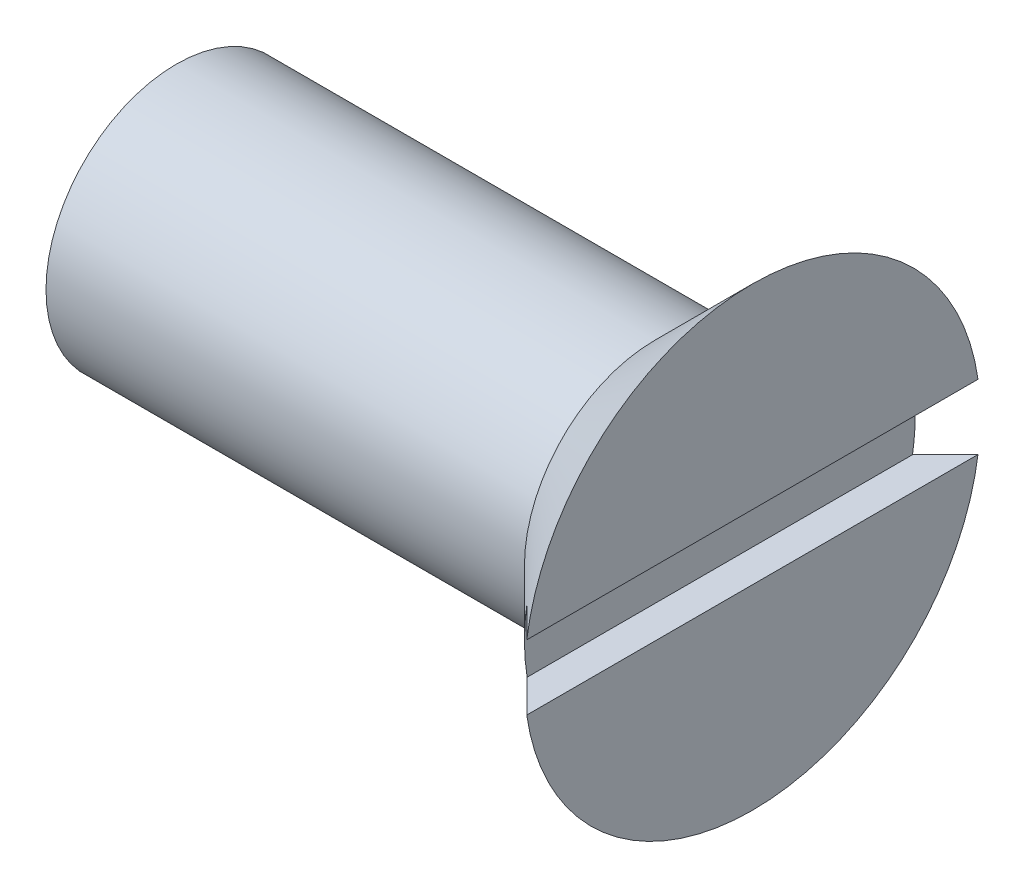
ISO-10303-21;
HEADER;
FILE_DESCRIPTION(('STEP AP214'),'2;1');
FILE_NAME('part.step','',(''),(''),'','','');
FILE_SCHEMA(('AUTOMOTIVE_DESIGN { 1 0 10303 214 1 1 1 1 }'));
ENDSEC;
DATA;
#1=APPLICATION_CONTEXT('core data for automotive mechanical design processes');
#2=APPLICATION_PROTOCOL_DEFINITION('international standard','automotive_design',2000,#1);
#3=PRODUCT_CONTEXT('',#1,'mechanical');
#4=PRODUCT('Part','Part','',(#3));
#5=PRODUCT_RELATED_PRODUCT_CATEGORY('part','',(#4));
#6=PRODUCT_DEFINITION_FORMATION('','',#4);
#7=PRODUCT_DEFINITION_CONTEXT('part definition',#1,'design');
#8=PRODUCT_DEFINITION('design','',#6,#7);
#9=PRODUCT_DEFINITION_SHAPE('','',#8);
#10=(LENGTH_UNIT() NAMED_UNIT(*) SI_UNIT(.MILLI.,.METRE.));
#11=(NAMED_UNIT(*) PLANE_ANGLE_UNIT() SI_UNIT($,.RADIAN.));
#12=(NAMED_UNIT(*) SI_UNIT($,.STERADIAN.) SOLID_ANGLE_UNIT());
#13=UNCERTAINTY_MEASURE_WITH_UNIT(LENGTH_MEASURE(1.E-05),#10,'distance_accuracy_value','');
#14=(GEOMETRIC_REPRESENTATION_CONTEXT(3) GLOBAL_UNCERTAINTY_ASSIGNED_CONTEXT((#13)) GLOBAL_UNIT_ASSIGNED_CONTEXT((#10,
#11,#12)) REPRESENTATION_CONTEXT('',''));
#15=CARTESIAN_POINT('',(0.,0.,0.));
#16=DIRECTION('',(0.,0.,1.));
#17=DIRECTION('',(1.,0.,0.));
#18=AXIS2_PLACEMENT_3D('',#15,#16,#17);
#19=CARTESIAN_POINT('',(0.,0.,6.99999999999997));
#20=DIRECTION('',(-1.,0.,0.));
#21=DIRECTION('',(0.,0.,1.));
#22=AXIS2_PLACEMENT_3D('',#19,#20,#21);
#23=PLANE('',#22);
#24=CARTESIAN_POINT('',(0.,0.,0.));
#25=DIRECTION('',(1.,0.,0.));
#26=DIRECTION('',(0.,0.,-1.));
#27=AXIS2_PLACEMENT_3D('',#24,#25,#26);
#28=CIRCLE('',#27,6.99999999999997);
#29=CARTESIAN_POINT('',(0.,-1.,6.92820323027548));
#30=VERTEX_POINT('',#29);
#31=CARTESIAN_POINT('',(0.,-1.,-6.92820323027548));
#32=VERTEX_POINT('',#31);
#33=EDGE_CURVE('E104',#30,#32,#28,.T.);
#34=ORIENTED_EDGE('',*,*,#33,.T.);
#35=DIRECTION('',(0.,0.,-1.));
#36=VECTOR('',#35,1.);
#37=CARTESIAN_POINT('',(0.,-1.,8.1189559473886));
#38=LINE('',#37,#36);
#39=EDGE_CURVE('E98',#30,#32,#38,.T.);
#40=ORIENTED_EDGE('',*,*,#39,.F.);
#41=EDGE_LOOP('',(#34,#40));
#42=FACE_BOUND('',#41,.T.);
#43=ADVANCED_FACE('F37',(#42),#23,.F.);
#44=CARTESIAN_POINT('',(0.,1.,-6.92820323027548));
#45=VERTEX_POINT('',#44);
#46=CARTESIAN_POINT('',(0.,1.,6.92820323027548));
#47=VERTEX_POINT('',#46);
#48=EDGE_CURVE('E97',#45,#47,#28,.T.);
#49=ORIENTED_EDGE('',*,*,#48,.T.);
#50=DIRECTION('',(0.,0.,1.));
#51=VECTOR('',#50,1.);
#52=CARTESIAN_POINT('',(0.,1.,8.1189559473886));
#53=LINE('',#52,#51);
#54=EDGE_CURVE('E87',#45,#47,#53,.T.);
#55=ORIENTED_EDGE('',*,*,#54,.F.);
#56=EDGE_LOOP('',(#49,#55));
#57=FACE_BOUND('',#56,.T.);
#58=ADVANCED_FACE('F39',(#57),#23,.F.);
#59=CARTESIAN_POINT('',(-3.,0.,0.));
#60=DIRECTION('',(1.,0.,0.));
#61=DIRECTION('',(0.,0.,-1.));
#62=AXIS2_PLACEMENT_3D('',#59,#60,#61);
#63=CONICAL_SURFACE('',#62,4.,0.785398163397443);
#64=ORIENTED_EDGE('',*,*,#33,.F.);
#65=CARTESIAN_POINT('',(0.0007,-1.,6.92891048361858));
#66=CARTESIAN_POINT('',(-0.203057035571808,-1.,6.72303316256359));
#67=CARTESIAN_POINT('',(-0.406729360026952,-1.,6.51707187455185));
#68=CARTESIAN_POINT('',(-0.813920126561537,-1.,6.10480594139753));
#69=CARTESIAN_POINT('',(-1.0174384512813,-1.,5.89850118035499));
#70=CARTESIAN_POINT('',(-1.42596532595888,-1.,5.48371812905269));
#71=CARTESIAN_POINT('',(-1.63097090803648,-1.,5.27523691340003));
#72=CARTESIAN_POINT('',(-2.04040574228826,-1.,4.8578998345015));
#73=CARTESIAN_POINT('',(-2.24483521820534,-1.,4.64904419065888));
#74=CARTESIAN_POINT('',(-2.72427791684727,-1.,4.15761447626168));
#75=CARTESIAN_POINT('',(-2.99901073458435,-1.,3.87476591022899));
#76=CARTESIAN_POINT('',(-3.40957112990383,-1.,3.4485640845595));
#77=CARTESIAN_POINT('',(-3.54627847148163,-1.,3.30605884619845));
#78=CARTESIAN_POINT('',(-3.81880344686512,-1.,3.02024639026733));
#79=CARTESIAN_POINT('',(-3.95462123373737,-1.,2.87693931898163));
#80=CARTESIAN_POINT('',(-4.22400906466863,-1.,2.59008412607903));
#81=CARTESIAN_POINT('',(-4.35758815449641,-1.,2.44654450622037));
#82=CARTESIAN_POINT('',(-4.62276875714421,-1.,2.15745558409888));
#83=CARTESIAN_POINT('',(-4.75436887785539,-1.,2.01190499374566));
#84=CARTESIAN_POINT('',(-4.94875744735089,-1.,1.7913042036442));
#85=CARTESIAN_POINT('',(-5.01295923437817,-1.,1.71750195608293));
#86=CARTESIAN_POINT('',(-5.14002729537216,-1.,1.56875923865624));
#87=CARTESIAN_POINT('',(-5.20289366222721,-1.,1.49381884858299));
#88=CARTESIAN_POINT('',(-5.32661717485925,-1.,1.34242779602236));
#89=CARTESIAN_POINT('',(-5.38747641709075,-1.,1.26597885188175));
#90=CARTESIAN_POINT('',(-5.5062179332972,-1.,1.11081200280599));
#91=CARTESIAN_POINT('',(-5.56410151388247,-1.,1.03209511782921));
#92=CARTESIAN_POINT('',(-5.6342785855607,-1.,0.930284620943717));
#93=CARTESIAN_POINT('',(-5.64885533391838,-1.,0.908764719009882));
#94=CARTESIAN_POINT('',(-5.67760006594019,-1.,0.865450807150558));
#95=CARTESIAN_POINT('',(-5.69176800999546,-1.,0.84365677095612));
#96=CARTESIAN_POINT('',(-5.73357137327975,-1.,0.77781424322307));
#97=CARTESIAN_POINT('',(-5.76050146347662,-1.,0.733312306171997));
#98=CARTESIAN_POINT('',(-5.81158630443363,-1.,0.643189751036011));
#99=CARTESIAN_POINT('',(-5.83576144432312,-1.,0.597580860294702));
#100=CARTESIAN_POINT('',(-5.88060287814264,-1.,0.504685851451451));
#101=CARTESIAN_POINT('',(-5.90127103101585,-1.,0.457400638086694));
#102=CARTESIAN_POINT('',(-5.94181804173317,-1.,0.350284008124888));
#103=CARTESIAN_POINT('',(-5.96052375362305,-1.,0.28998033143191));
#104=CARTESIAN_POINT('',(-5.98103441259765,-1.,0.197951670774295));
#105=CARTESIAN_POINT('',(-5.98661075812361,-1.,0.167057662276306));
#106=CARTESIAN_POINT('',(-5.99498351726332,-1.,0.104901288970746));
#107=CARTESIAN_POINT('',(-5.99778131403292,-1.,0.0736391152855493));
#108=CARTESIAN_POINT('',(-6.00043844835707,-1.,0.0107656032003205));
#109=CARTESIAN_POINT('',(-6.00027684614894,-1.,-0.0208466403754252));
#110=CARTESIAN_POINT('',(-5.99698162275985,-1.,-0.0839085049733294));
#111=CARTESIAN_POINT('',(-5.99384795205812,-1.,-0.115358123277037));
#112=CARTESIAN_POINT('',(-5.98021522368943,-1.,-0.20924151416752));
#113=CARTESIAN_POINT('',(-5.96548010654113,-1.,-0.271081624004798));
#114=CARTESIAN_POINT('',(-5.93126244617195,-1.,-0.379923283062236));
#115=CARTESIAN_POINT('',(-5.91329770693314,-1.,-0.427438361689901));
#116=CARTESIAN_POINT('',(-5.87331526059934,-1.,-0.520761063772278));
#117=CARTESIAN_POINT('',(-5.85129407383588,-1.,-0.56656718038011));
#118=CARTESIAN_POINT('',(-5.80419726897019,-1.,-0.656838276234032));
#119=CARTESIAN_POINT('',(-5.77910721092545,-1.,-0.701295582867664));
#120=CARTESIAN_POINT('',(-5.72677273473167,-1.,-0.788883885515427));
#121=CARTESIAN_POINT('',(-5.69952928455777,-1.,-0.832015465485537));
#122=CARTESIAN_POINT('',(-5.63800540463174,-1.,-0.925471709874398));
#123=CARTESIAN_POINT('',(-5.60338433634081,-1.,-0.975570691727015));
#124=CARTESIAN_POINT('',(-5.5324962851981,-1.,-1.07459510945153));
#125=CARTESIAN_POINT('',(-5.49622898228081,-1.,-1.12352031426367));
#126=CARTESIAN_POINT('',(-5.38558374457739,-1.,-1.26899386002681));
#127=CARTESIAN_POINT('',(-5.30940959905511,-1.,-1.36417139059564));
#128=CARTESIAN_POINT('',(-5.1541160860679,-1.,-1.55244486687053));
#129=CARTESIAN_POINT('',(-5.07499001777941,-1.,-1.64553519850053));
#130=CARTESIAN_POINT('',(-4.91499011603767,-1.,-1.83013154774707));
#131=CARTESIAN_POINT('',(-4.83411700646749,-1.,-1.92163819428915));
#132=CARTESIAN_POINT('',(-4.67094323318478,-1.,-2.10384108512927));
#133=CARTESIAN_POINT('',(-4.58863912644483,-1.,-2.19453423304611));
#134=CARTESIAN_POINT('',(-4.42317325924135,-1.,-2.37515018432563));
#135=CARTESIAN_POINT('',(-4.34001141351135,-1.,-2.46507290944307));
#136=CARTESIAN_POINT('',(-4.08985682055217,-1.,-2.73372270948266));
#137=CARTESIAN_POINT('',(-3.92195207413921,-1.,-2.91159954370395));
#138=CARTESIAN_POINT('',(-3.5980934458966,-1.,-3.2519901305964));
#139=CARTESIAN_POINT('',(-3.44224573312931,-1.,-3.4146053442988));
#140=CARTESIAN_POINT('',(-3.12975650705818,-1.,-3.73907557673527));
#141=CARTESIAN_POINT('',(-2.97311498229484,-1.,-3.90093058442962));
#142=CARTESIAN_POINT('',(-2.50220865581387,-1.,-4.38590701059388));
#143=CARTESIAN_POINT('',(-2.18714351198228,-1.,-4.70825051819389));
#144=CARTESIAN_POINT('',(-1.56020891391055,-1.,-5.34743373895776));
#145=CARTESIAN_POINT('',(-1.24835469347943,-1.,-5.66428842673968));
#146=CARTESIAN_POINT('',(-0.780167087478891,-1.,-6.13897334126288));
#147=CARTESIAN_POINT('',(-0.624086009194372,-1.,-6.29705248598904));
#148=CARTESIAN_POINT('',(-0.311787530645909,-1.,-6.6130753277509));
#149=CARTESIAN_POINT('',(-0.155570130706338,-1.,-6.77101902510714));
#150=CARTESIAN_POINT('',(0.000699999999996532,-1.,-6.92891048361859));
#151=B_SPLINE_CURVE_WITH_KNOTS('',3,(#65,#66,#67,#68,#69,#70,#71,#72,#73,#74,#75,#76,#77,#78,
#79,#80,#81,#82,#83,#84,#85,#86,#87,#88,#89,#90,#91,#92,#93,#94,#95,#96,#97,#98,#99,#100,#101,
#102,#103,#104,#105,#106,#107,#108,#109,#110,#111,#112,#113,#114,#115,#116,#117,#118,#119,#120,
#121,#122,#123,#124,#125,#126,#127,#128,#129,#130,#131,#132,#133,#134,#135,#136,#137,#138,#139,
#140,#141,#142,#143,#144,#145,#146,#147,#148,#149,#150),.UNSPECIFIED.,.F.,.F.,(4,2,2,2,2,2,2,2,
2,2,2,2,2,2,2,2,2,2,2,2,2,2,2,2,2,2,2,2,2,2,2,2,2,2,2,2,2,2,2,2,2,2,4),(0.,0.868977425656901,
1.73836338077462,2.61553157963544,3.49229172052614,4.67521635984703,5.26764128955434,
5.85996145073853,6.44819042364134,7.03681546486488,7.330263786098,7.62369162854722,
7.91680259663712,8.2097837409415,8.2877558481282,8.36573548480098,8.52172024000569,
8.67646310654948,8.83112369079295,9.01979649465293,9.11386952674581,9.20789570596849,
9.30258743987305,9.39728075156455,9.5870462518338,9.73923570692478,9.89155632506298,
10.0446234192784,10.1976220951081,10.3802678574152,10.5629492836054,10.9285618237704,
11.29506191293,11.6614129507236,12.0288200188595,12.3962639692799,13.1300665061445,
13.8057783731923,14.481500022789,15.8337299047227,17.167464075302,17.8339119405179,
18.5003582242432),.UNSPECIFIED.);
#152=CARTESIAN_POINT('',(-1.,-1.,5.91607978309959));
#153=VERTEX_POINT('',#152);
#154=EDGE_CURVE('E11',#30,#153,#151,.T.);
#155=ORIENTED_EDGE('',*,*,#154,.T.);
#156=CARTESIAN_POINT('',(-1.,0.,0.));
#157=DIRECTION('',(1.,0.,0.));
#158=DIRECTION('',(0.,0.,-1.));
#159=AXIS2_PLACEMENT_3D('',#156,#157,#158);
#160=CIRCLE('',#159,5.99999999999998);
#161=CARTESIAN_POINT('',(-1.,1.,5.91607978309959));
#162=VERTEX_POINT('',#161);
#163=EDGE_CURVE('E107',#162,#153,#160,.T.);
#164=ORIENTED_EDGE('',*,*,#163,.F.);
#165=CARTESIAN_POINT('',(0.0007,1.,-6.92891048361858));
#166=CARTESIAN_POINT('',(-0.203057035571808,1.,-6.72303316256359));
#167=CARTESIAN_POINT('',(-0.406729360026952,1.,-6.51707187455185));
#168=CARTESIAN_POINT('',(-0.813920126561537,1.,-6.10480594139753));
#169=CARTESIAN_POINT('',(-1.0174384512813,1.,-5.89850118035499));
#170=CARTESIAN_POINT('',(-1.42596532595888,1.,-5.48371812905269));
#171=CARTESIAN_POINT('',(-1.63097090803648,1.,-5.27523691340003));
#172=CARTESIAN_POINT('',(-2.04040574228826,1.,-4.8578998345015));
#173=CARTESIAN_POINT('',(-2.24483521820534,1.,-4.64904419065888));
#174=CARTESIAN_POINT('',(-2.72427791684727,1.,-4.15761447626168));
#175=CARTESIAN_POINT('',(-2.99901073458435,1.,-3.87476591022899));
#176=CARTESIAN_POINT('',(-3.40957112990383,1.,-3.4485640845595));
#177=CARTESIAN_POINT('',(-3.54627847148163,1.,-3.30605884619845));
#178=CARTESIAN_POINT('',(-3.81880344686512,1.,-3.02024639026733));
#179=CARTESIAN_POINT('',(-3.95462123373737,1.,-2.87693931898163));
#180=CARTESIAN_POINT('',(-4.22400906466863,1.,-2.59008412607903));
#181=CARTESIAN_POINT('',(-4.35758815449641,1.,-2.44654450622037));
#182=CARTESIAN_POINT('',(-4.62276875714421,1.,-2.15745558409888));
#183=CARTESIAN_POINT('',(-4.75436887785539,1.,-2.01190499374566));
#184=CARTESIAN_POINT('',(-4.94875744735089,1.,-1.7913042036442));
#185=CARTESIAN_POINT('',(-5.01295923437817,1.,-1.71750195608293));
#186=CARTESIAN_POINT('',(-5.14002729537216,1.,-1.56875923865624));
#187=CARTESIAN_POINT('',(-5.20289366222721,1.,-1.49381884858299));
#188=CARTESIAN_POINT('',(-5.32661717485925,1.,-1.34242779602236));
#189=CARTESIAN_POINT('',(-5.38747641709075,1.,-1.26597885188175));
#190=CARTESIAN_POINT('',(-5.5062179332972,1.,-1.11081200280599));
#191=CARTESIAN_POINT('',(-5.56410151388247,1.,-1.03209511782921));
#192=CARTESIAN_POINT('',(-5.6342785855607,1.,-0.930284620943717));
#193=CARTESIAN_POINT('',(-5.64885533391838,1.,-0.908764719009882));
#194=CARTESIAN_POINT('',(-5.67760006594019,1.,-0.865450807150558));
#195=CARTESIAN_POINT('',(-5.69176800999546,1.,-0.84365677095612));
#196=CARTESIAN_POINT('',(-5.73357137327975,1.,-0.77781424322307));
#197=CARTESIAN_POINT('',(-5.76050146347662,1.,-0.733312306171997));
#198=CARTESIAN_POINT('',(-5.81158630443363,1.,-0.643189751036011));
#199=CARTESIAN_POINT('',(-5.83576144432312,1.,-0.597580860294702));
#200=CARTESIAN_POINT('',(-5.88060287814264,1.,-0.504685851451451));
#201=CARTESIAN_POINT('',(-5.90127103101585,1.,-0.457400638086694));
#202=CARTESIAN_POINT('',(-5.94181804173317,1.,-0.350284008124888));
#203=CARTESIAN_POINT('',(-5.96052375362305,1.,-0.28998033143191));
#204=CARTESIAN_POINT('',(-5.98103441259765,1.,-0.197951670774295));
#205=CARTESIAN_POINT('',(-5.98661075812361,1.,-0.167057662276306));
#206=CARTESIAN_POINT('',(-5.99498351726332,1.,-0.104901288970746));
#207=CARTESIAN_POINT('',(-5.99778131403292,1.,-0.0736391152855493));
#208=CARTESIAN_POINT('',(-6.00043844835707,1.,-0.0107656032003205));
#209=CARTESIAN_POINT('',(-6.00027684614894,1.,0.0208466403754252));
#210=CARTESIAN_POINT('',(-5.99698162275985,1.,0.0839085049733294));
#211=CARTESIAN_POINT('',(-5.99384795205812,1.,0.115358123277037));
#212=CARTESIAN_POINT('',(-5.98021522368943,1.,0.20924151416752));
#213=CARTESIAN_POINT('',(-5.96548010654113,1.,0.271081624004798));
#214=CARTESIAN_POINT('',(-5.93126244617195,1.,0.379923283062236));
#215=CARTESIAN_POINT('',(-5.91329770693314,1.,0.427438361689901));
#216=CARTESIAN_POINT('',(-5.87331526059934,1.,0.520761063772278));
#217=CARTESIAN_POINT('',(-5.85129407383588,1.,0.56656718038011));
#218=CARTESIAN_POINT('',(-5.80419726897019,1.,0.656838276234032));
#219=CARTESIAN_POINT('',(-5.77910721092545,1.,0.701295582867664));
#220=CARTESIAN_POINT('',(-5.72677273473167,1.,0.788883885515427));
#221=CARTESIAN_POINT('',(-5.69952928455777,1.,0.832015465485537));
#222=CARTESIAN_POINT('',(-5.63800540463174,1.,0.925471709874398));
#223=CARTESIAN_POINT('',(-5.60338433634081,1.,0.975570691727015));
#224=CARTESIAN_POINT('',(-5.5324962851981,1.,1.07459510945153));
#225=CARTESIAN_POINT('',(-5.49622898228081,1.,1.12352031426367));
#226=CARTESIAN_POINT('',(-5.38558374457739,1.,1.26899386002681));
#227=CARTESIAN_POINT('',(-5.30940959905511,1.,1.36417139059564));
#228=CARTESIAN_POINT('',(-5.1541160860679,1.,1.55244486687053));
#229=CARTESIAN_POINT('',(-5.07499001777941,1.,1.64553519850053));
#230=CARTESIAN_POINT('',(-4.91499011603767,1.,1.83013154774707));
#231=CARTESIAN_POINT('',(-4.83411700646749,1.,1.92163819428915));
#232=CARTESIAN_POINT('',(-4.67094323318478,1.,2.10384108512927));
#233=CARTESIAN_POINT('',(-4.58863912644483,1.,2.19453423304611));
#234=CARTESIAN_POINT('',(-4.42317325924135,1.,2.37515018432563));
#235=CARTESIAN_POINT('',(-4.34001141351135,1.,2.46507290944307));
#236=CARTESIAN_POINT('',(-4.08985682055217,1.,2.73372270948266));
#237=CARTESIAN_POINT('',(-3.92195207413921,1.,2.91159954370395));
#238=CARTESIAN_POINT('',(-3.5980934458966,1.,3.2519901305964));
#239=CARTESIAN_POINT('',(-3.44224573312931,1.,3.4146053442988));
#240=CARTESIAN_POINT('',(-3.12975650705818,1.,3.73907557673527));
#241=CARTESIAN_POINT('',(-2.97311498229484,1.,3.90093058442962));
#242=CARTESIAN_POINT('',(-2.50220865581387,1.,4.38590701059388));
#243=CARTESIAN_POINT('',(-2.18714351198228,1.,4.70825051819389));
#244=CARTESIAN_POINT('',(-1.56020891391055,1.,5.34743373895776));
#245=CARTESIAN_POINT('',(-1.24835469347943,1.,5.66428842673968));
#246=CARTESIAN_POINT('',(-0.780167087478891,1.,6.13897334126288));
#247=CARTESIAN_POINT('',(-0.624086009194372,1.,6.29705248598904));
#248=CARTESIAN_POINT('',(-0.311787530645909,1.,6.6130753277509));
#249=CARTESIAN_POINT('',(-0.155570130706338,1.,6.77101902510714));
#250=CARTESIAN_POINT('',(0.000699999999996532,1.,6.92891048361859));
#251=B_SPLINE_CURVE_WITH_KNOTS('',3,(#165,#166,#167,#168,#169,#170,#171,#172,#173,#174,#175,
#176,#177,#178,#179,#180,#181,#182,#183,#184,#185,#186,#187,#188,#189,#190,#191,#192,#193,#194,
#195,#196,#197,#198,#199,#200,#201,#202,#203,#204,#205,#206,#207,#208,#209,#210,#211,#212,#213,
#214,#215,#216,#217,#218,#219,#220,#221,#222,#223,#224,#225,#226,#227,#228,#229,#230,#231,#232,
#233,#234,#235,#236,#237,#238,#239,#240,#241,#242,#243,#244,#245,#246,#247,#248,#249,#250),
.UNSPECIFIED.,.F.,.F.,(4,2,2,2,2,2,2,2,2,2,2,2,2,2,2,2,2,2,2,2,2,2,2,2,2,2,2,2,2,2,2,2,2,2,2,2,
2,2,2,2,2,2,4),(0.,0.868977425656901,1.73836338077462,2.61553157963544,3.49229172052614,
4.67521635984703,5.26764128955434,5.85996145073853,6.44819042364134,7.03681546486488,
7.330263786098,7.62369162854722,7.91680259663712,8.2097837409415,8.2877558481282,
8.36573548480098,8.52172024000569,8.67646310654948,8.83112369079295,9.01979649465293,
9.11386952674581,9.20789570596849,9.30258743987305,9.39728075156455,9.5870462518338,
9.73923570692478,9.89155632506298,10.0446234192784,10.1976220951081,10.3802678574152,
10.5629492836054,10.9285618237704,11.29506191293,11.6614129507236,12.0288200188595,
12.3962639692799,13.1300665061445,13.8057783731923,14.481500022789,15.8337299047227,
17.167464075302,17.8339119405179,18.5003582242432),.UNSPECIFIED.);
#252=EDGE_CURVE('E51',#162,#47,#251,.T.);
#253=ORIENTED_EDGE('',*,*,#252,.T.);
#254=ORIENTED_EDGE('',*,*,#48,.F.);
#255=CARTESIAN_POINT('',(-1.,1.,-5.91607978309959));
#256=VERTEX_POINT('',#255);
#257=EDGE_CURVE('E84',#45,#256,#251,.T.);
#258=ORIENTED_EDGE('',*,*,#257,.T.);
#259=CARTESIAN_POINT('',(-1.,-1.,-5.91607978309959));
#260=VERTEX_POINT('',#259);
#261=EDGE_CURVE('E94',#260,#256,#160,.T.);
#262=ORIENTED_EDGE('',*,*,#261,.F.);
#263=EDGE_CURVE('E41',#260,#32,#151,.T.);
#264=ORIENTED_EDGE('',*,*,#263,.T.);
#265=EDGE_LOOP('',(#64,#155,#164,#253,#254,#258,#262,#264));
#266=FACE_BOUND('',#265,.T.);
#267=CARTESIAN_POINT('',(-3.,0.,0.));
#268=DIRECTION('',(1.,0.,0.));
#269=DIRECTION('',(0.,0.,-1.));
#270=AXIS2_PLACEMENT_3D('',#267,#268,#269);
#271=CIRCLE('',#270,4.);
#272=CARTESIAN_POINT('',(-3.,0.,-4.));
#273=VERTEX_POINT('',#272);
#274=EDGE_CURVE('E109',#273,#273,#271,.T.);
#275=ORIENTED_EDGE('',*,*,#274,.T.);
#276=EDGE_LOOP('',(#275));
#277=FACE_BOUND('',#276,.T.);
#278=ADVANCED_FACE('F101',(#266,#277),#63,.T.);
#279=CARTESIAN_POINT('',(0.,0.,0.));
#280=DIRECTION('',(1.,0.,0.));
#281=DIRECTION('',(0.,0.,-1.));
#282=AXIS2_PLACEMENT_3D('',#279,#280,#281);
#283=CYLINDRICAL_SURFACE('',#282,4.);
#284=ORIENTED_EDGE('',*,*,#274,.F.);
#285=EDGE_LOOP('',(#284));
#286=FACE_BOUND('',#285,.T.);
#287=CARTESIAN_POINT('',(-17.6905989232415,0.,0.));
#288=DIRECTION('',(1.,0.,0.));
#289=DIRECTION('',(0.,0.,-1.));
#290=AXIS2_PLACEMENT_3D('',#287,#288,#289);
#291=CIRCLE('',#290,4.);
#292=CARTESIAN_POINT('',(-17.6905989232415,0.,-4.));
#293=VERTEX_POINT('',#292);
#294=EDGE_CURVE('E145',#293,#293,#291,.T.);
#295=ORIENTED_EDGE('',*,*,#294,.T.);
#296=EDGE_LOOP('',(#295));
#297=FACE_BOUND('',#296,.T.);
#298=ADVANCED_FACE('F128',(#286,#297),#283,.T.);
#299=CARTESIAN_POINT('',(-20.,0.,0.));
#300=DIRECTION('',(1.,0.,0.));
#301=DIRECTION('',(0.,0.,-1.));
#302=AXIS2_PLACEMENT_3D('',#299,#300,#301);
#303=CONICAL_SURFACE('',#302,0.,1.04719755119659);
#304=ORIENTED_EDGE('',*,*,#294,.F.);
#305=EDGE_LOOP('',(#304));
#306=FACE_BOUND('',#305,.T.);
#307=CARTESIAN_POINT('',(-20.,0.,0.));
#308=VERTEX_POINT('',#307);
#309=VERTEX_LOOP('',#308);
#310=FACE_BOUND('',#309,.T.);
#311=ADVANCED_FACE('F126',(#306,#310),#303,.T.);
#312=CARTESIAN_POINT('',(-1.,-1.,8.1189559473886));
#313=DIRECTION('',(0.,-1.,0.));
#314=DIRECTION('',(0.,0.,-1.));
#315=AXIS2_PLACEMENT_3D('',#312,#313,#314);
#316=PLANE('',#315);
#317=ORIENTED_EDGE('',*,*,#39,.T.);
#318=ORIENTED_EDGE('',*,*,#263,.F.);
#319=DIRECTION('',(0.,0.,-1.));
#320=VECTOR('',#319,1.);
#321=CARTESIAN_POINT('',(-1.,-1.,8.1189559473886));
#322=LINE('',#321,#320);
#323=EDGE_CURVE('E58',#153,#260,#322,.T.);
#324=ORIENTED_EDGE('',*,*,#323,.F.);
#325=ORIENTED_EDGE('',*,*,#154,.F.);
#326=EDGE_LOOP('',(#317,#318,#324,#325));
#327=FACE_BOUND('',#326,.T.);
#328=ADVANCED_FACE('F123',(#327),#316,.F.);
#329=CARTESIAN_POINT('',(-1.,1.,8.1189559473886));
#330=DIRECTION('',(0.,1.,0.));
#331=DIRECTION('',(0.,0.,1.));
#332=AXIS2_PLACEMENT_3D('',#329,#330,#331);
#333=PLANE('',#332);
#334=ORIENTED_EDGE('',*,*,#54,.T.);
#335=ORIENTED_EDGE('',*,*,#252,.F.);
#336=DIRECTION('',(0.,0.,1.));
#337=VECTOR('',#336,1.);
#338=CARTESIAN_POINT('',(-1.,1.,8.1189559473886));
#339=LINE('',#338,#337);
#340=EDGE_CURVE('E90',#256,#162,#339,.T.);
#341=ORIENTED_EDGE('',*,*,#340,.F.);
#342=ORIENTED_EDGE('',*,*,#257,.F.);
#343=EDGE_LOOP('',(#334,#335,#341,#342));
#344=FACE_BOUND('',#343,.T.);
#345=ADVANCED_FACE('F86',(#344),#333,.F.);
#346=CARTESIAN_POINT('',(-1.,0.,0.));
#347=DIRECTION('',(1.,0.,0.));
#348=DIRECTION('',(0.,0.,-1.));
#349=AXIS2_PLACEMENT_3D('',#346,#347,#348);
#350=PLANE('',#349);
#351=ORIENTED_EDGE('',*,*,#163,.T.);
#352=ORIENTED_EDGE('',*,*,#323,.T.);
#353=ORIENTED_EDGE('',*,*,#261,.T.);
#354=ORIENTED_EDGE('',*,*,#340,.T.);
#355=EDGE_LOOP('',(#351,#352,#353,#354));
#356=FACE_BOUND('',#355,.T.);
#357=ADVANCED_FACE('F122',(#356),#350,.T.);
#358=CLOSED_SHELL('',(#43,#58,#278,#298,#311,#328,#345,#357));
#359=MANIFOLD_SOLID_BREP('B2',#358);
#360=ADVANCED_BREP_SHAPE_REPRESENTATION('',(#18,#359),#14);
#361=SHAPE_DEFINITION_REPRESENTATION(#9,#360);
ENDSEC;
END-ISO-10303-21;
